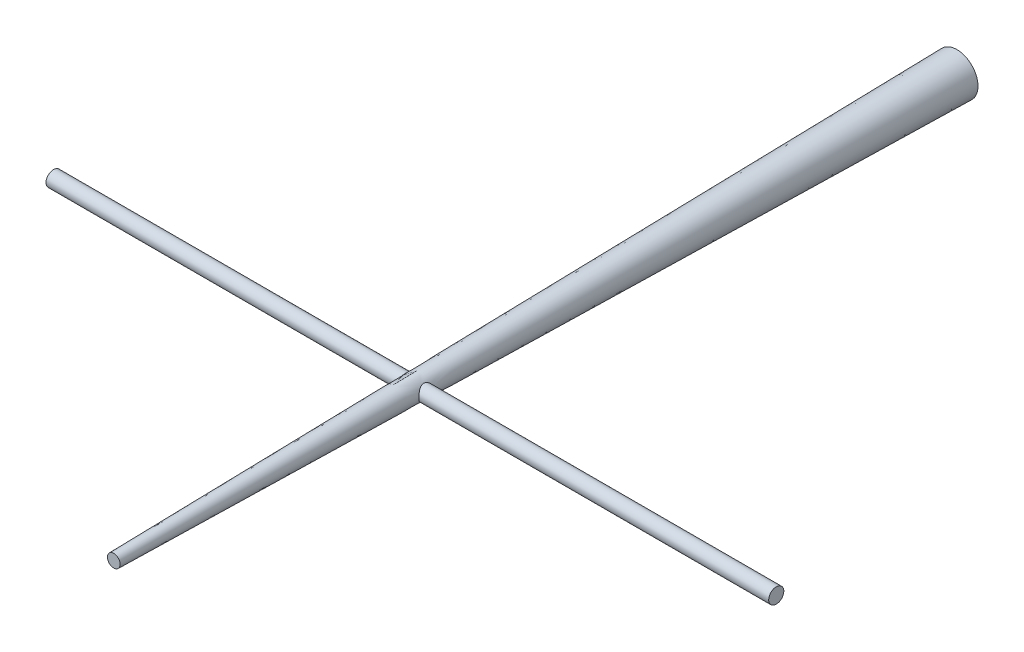
ISO-10303-21;
HEADER;
FILE_DESCRIPTION(('STEP AP214'),'2;1');
FILE_NAME('part.step','',(''),(''),'','','');
FILE_SCHEMA(('AUTOMOTIVE_DESIGN { 1 0 10303 214 1 1 1 1 }'));
ENDSEC;
DATA;
#1=APPLICATION_CONTEXT('core data for automotive mechanical design processes');
#2=APPLICATION_PROTOCOL_DEFINITION('international standard','automotive_design',2000,#1);
#3=PRODUCT_CONTEXT('',#1,'mechanical');
#4=PRODUCT('Part','Part','',(#3));
#5=PRODUCT_RELATED_PRODUCT_CATEGORY('part','',(#4));
#6=PRODUCT_DEFINITION_FORMATION('','',#4);
#7=PRODUCT_DEFINITION_CONTEXT('part definition',#1,'design');
#8=PRODUCT_DEFINITION('design','',#6,#7);
#9=PRODUCT_DEFINITION_SHAPE('','',#8);
#10=(LENGTH_UNIT() NAMED_UNIT(*) SI_UNIT(.MILLI.,.METRE.));
#11=(NAMED_UNIT(*) PLANE_ANGLE_UNIT() SI_UNIT($,.RADIAN.));
#12=(NAMED_UNIT(*) SI_UNIT($,.STERADIAN.) SOLID_ANGLE_UNIT());
#13=UNCERTAINTY_MEASURE_WITH_UNIT(LENGTH_MEASURE(1.E-05),#10,'distance_accuracy_value','');
#14=(GEOMETRIC_REPRESENTATION_CONTEXT(3) GLOBAL_UNCERTAINTY_ASSIGNED_CONTEXT((#13)) GLOBAL_UNIT_ASSIGNED_CONTEXT((#10,
#11,#12)) REPRESENTATION_CONTEXT('',''));
#15=CARTESIAN_POINT('',(0.,0.,0.));
#16=DIRECTION('',(0.,0.,1.));
#17=DIRECTION('',(1.,0.,0.));
#18=AXIS2_PLACEMENT_3D('',#15,#16,#17);
#19=CARTESIAN_POINT('',(0.,0.,0.));
#20=DIRECTION('',(0.,0.,-1.));
#21=DIRECTION('',(1.,0.,0.));
#22=AXIS2_PLACEMENT_3D('',#19,#20,#21);
#23=CONICAL_SURFACE('',#22,175.,0.0174532925199433);
#24=CARTESIAN_POINT('',(-88.2150417104571,-41.0089389072612,4452.50860679988));
#25=CARTESIAN_POINT('',(-88.8067551006763,-39.7800268956381,4451.44744015487));
#26=CARTESIAN_POINT('',(-89.3866715677512,-38.5065582815017,4450.43104609491));
#27=CARTESIAN_POINT('',(-90.5116746114934,-35.8741062610072,4448.49383958043));
#28=CARTESIAN_POINT('',(-91.0567584669479,-34.5151161899146,4447.57303459007));
#29=CARTESIAN_POINT('',(-92.1014047116843,-31.7155180485526,4445.8335083747));
#30=CARTESIAN_POINT('',(-92.6009440945044,-30.2748693183429,4445.01483866652));
#31=CARTESIAN_POINT('',(-93.5436104078845,-27.318236510657,4443.48764497268));
#32=CARTESIAN_POINT('',(-93.9867390836993,-25.8022547658794,4442.77911757924));
#33=CARTESIAN_POINT('',(-94.6028341853943,-23.4728650210854,4441.8028661265));
#34=CARTESIAN_POINT('',(-94.8007182534843,-22.6842486912337,4441.49091491734));
#35=CARTESIAN_POINT('',(-95.1784014771755,-21.0912308404779,4440.89799128026));
#36=CARTESIAN_POINT('',(-95.3582027048802,-20.2868311408356,4440.61701530255));
#37=CARTESIAN_POINT('',(-95.6986028227212,-18.6634446459311,4440.0869746647));
#38=CARTESIAN_POINT('',(-95.8591987267517,-17.8444556049569,4439.83791496658));
#39=CARTESIAN_POINT('',(-96.160081205876,-16.1935978613828,4439.37271087411));
#40=CARTESIAN_POINT('',(-96.3003702908553,-15.36173076458,4439.15656241182));
#41=CARTESIAN_POINT('',(-96.5596022520418,-13.6873116584538,4438.75815949005));
#42=CARTESIAN_POINT('',(-96.678561410206,-12.8447683292775,4438.57587917383));
#43=CARTESIAN_POINT('',(-96.8944153756877,-11.1502554879983,4438.24579145945));
#44=CARTESIAN_POINT('',(-96.991312899643,-10.29828715004,4438.09797981682));
#45=CARTESIAN_POINT('',(-97.1623592499996,-8.58676171566456,4437.837452627));
#46=CARTESIAN_POINT('',(-97.2365089049002,-7.7272048968005,4437.72473580162));
#47=CARTESIAN_POINT('',(-97.3615154169589,-6.00249424641401,4437.5349044306));
#48=CARTESIAN_POINT('',(-97.4123729243703,-5.13734057182445,4437.45778889107));
#49=CARTESIAN_POINT('',(-97.4862819704082,-3.49541762183553,4437.34578166787));
#50=CARTESIAN_POINT('',(-97.5117091536608,-2.71899849624941,4437.30728126237));
#51=CARTESIAN_POINT('',(-97.543495515013,-1.16480269875645,4437.25915830888));
#52=CARTESIAN_POINT('',(-97.5498530895679,-0.387025918187787,4437.2495381894));
#53=CARTESIAN_POINT('',(-97.5434566543303,1.16813433460402,4437.25921963327));
#54=CARTESIAN_POINT('',(-97.5307059032239,1.9455178512784,4437.27851626524));
#55=CARTESIAN_POINT('',(-97.4861741815847,3.49856552502829,4437.34595203199));
#56=CARTESIAN_POINT('',(-97.4543912585527,4.27422949750108,4437.394094126));
#57=CARTESIAN_POINT('',(-97.3719909613902,5.82212631131907,4437.51903368842));
#58=CARTESIAN_POINT('',(-97.3213763244169,6.59435963480462,4437.59582699243));
#59=CARTESIAN_POINT('',(-97.2016088467075,8.13410615537032,4437.77779422268));
#60=CARTESIAN_POINT('',(-97.1324540471383,8.90161884492897,4437.88297114776));
#61=CARTESIAN_POINT('',(-96.9760197286419,10.430349498098,4438.12131524261));
#62=CARTESIAN_POINT('',(-96.8887421241509,11.1915681177695,4438.25447945591));
#63=CARTESIAN_POINT('',(-96.6965660286601,12.7064522726591,4438.54833463863));
#64=CARTESIAN_POINT('',(-96.5916658779307,13.4601170893524,4438.70902820085));
#65=CARTESIAN_POINT('',(-96.2616216831136,15.6402116122225,4439.21590811345));
#66=CARTESIAN_POINT('',(-96.0138848798007,17.0551296442072,4439.59788103185));
#67=CARTESIAN_POINT('',(-95.4611398543868,19.8442998354549,4440.45590561592));
#68=CARTESIAN_POINT('',(-95.1561341348468,21.2185537686382,4440.93195317072));
#69=CARTESIAN_POINT('',(-94.4944694411458,23.920039862333,4441.9733443069));
#70=CARTESIAN_POINT('',(-94.1378071167552,25.2472689660582,4442.53869368024));
#71=CARTESIAN_POINT('',(-93.3790532346756,27.8490938365394,4443.75361858164));
#72=CARTESIAN_POINT('',(-92.9769588327593,29.1236863012056,4444.40319938329));
#73=CARTESIAN_POINT('',(-92.0914970552191,31.7411700527384,4445.8509499274));
#74=CARTESIAN_POINT('',(-91.6040229767769,33.0780416528376,4446.65749288845));
#75=CARTESIAN_POINT('',(-90.5910602719331,35.6780961521958,4448.3603395413));
#76=CARTESIAN_POINT('',(-90.0655695626268,36.9412750070208,4449.25664815233));
#77=CARTESIAN_POINT('',(-88.9854120880967,39.391432145557,4451.1342166535));
#78=CARTESIAN_POINT('',(-88.4307208804156,40.5783446838695,4452.11554817094));
#79=CARTESIAN_POINT('',(-87.30210858388,42.8719329880945,4454.15765123253));
#80=CARTESIAN_POINT('',(-86.7281864957257,43.9786045749393,4455.2184269084));
#81=CARTESIAN_POINT('',(-85.4773353908995,46.28147264725,4457.59303192547));
#82=CARTESIAN_POINT('',(-84.7987547969908,47.4632145998366,4458.92004584035));
#83=CARTESIAN_POINT('',(-83.4450309003382,49.7110137911037,4461.67068939557));
#84=CARTESIAN_POINT('',(-82.7698881999231,50.777051380559,4463.09433537972));
#85=CARTESIAN_POINT('',(-81.4406417500109,52.7884855521617,4466.03365637022));
#86=CARTESIAN_POINT('',(-80.7865365585378,53.7338904160873,4467.5493250484));
#87=CARTESIAN_POINT('',(-79.5185263353984,55.49808392586,4470.66849487191));
#88=CARTESIAN_POINT('',(-78.9046120594359,56.316901747351,4472.27197566267));
#89=CARTESIAN_POINT('',(-77.8484802311197,57.6780779146254,4475.25018027478));
#90=CARTESIAN_POINT('',(-77.3957680618075,58.243423544509,4476.6106964112));
#91=CARTESIAN_POINT('',(-76.5424994649826,59.2813346929939,4479.38256325502));
#92=CARTESIAN_POINT('',(-76.141937706547,59.7539096973123,4480.79390874769));
#93=CARTESIAN_POINT('',(-75.4057144699684,60.6004924008325,4483.66062885371));
#94=CARTESIAN_POINT('',(-75.0699664766281,60.9746317403301,4485.11594173299));
#95=CARTESIAN_POINT('',(-74.6234743652947,61.4583893635324,4487.32711773009));
#96=CARTESIAN_POINT('',(-74.4841488481218,61.6067496318438,4488.06898987085));
#97=CARTESIAN_POINT('',(-74.225861495448,61.8770367632609,4489.56101926765));
#98=CARTESIAN_POINT('',(-74.1068973194686,61.9989666648922,4490.31117556089));
#99=CARTESIAN_POINT('',(-73.8895795190012,62.2167850559781,4491.82520036291));
#100=CARTESIAN_POINT('',(-73.791419345275,62.3124313818698,4492.58913149942));
#101=CARTESIAN_POINT('',(-73.6181262529895,62.4757143960929,4494.12250265417));
#102=CARTESIAN_POINT('',(-73.542990689765,62.5433543016263,4494.89194202933));
#103=CARTESIAN_POINT('',(-73.4165568445914,62.6502414864425,4496.43479058127));
#104=CARTESIAN_POINT('',(-73.3652598345658,62.6894872507971,4497.20819996767));
#105=CARTESIAN_POINT('',(-73.2870677371926,62.739312466473,4498.75717550974));
#106=CARTESIAN_POINT('',(-73.2601725802002,62.7498919996102,4499.53274165925));
#107=CARTESIAN_POINT('',(-73.2310514899403,62.7422656134858,4501.08400075595));
#108=CARTESIAN_POINT('',(-73.2288192979925,62.7240669985476,4501.85969362102));
#109=CARTESIAN_POINT('',(-73.248961270952,62.6589345715854,4503.4095483375));
#110=CARTESIAN_POINT('',(-73.2713354924159,62.6120006935148,4504.18371018538));
#111=CARTESIAN_POINT('',(-73.340340441106,62.4895858291731,4505.72865800128));
#112=CARTESIAN_POINT('',(-73.3869700305379,62.4141061819999,4506.49944412594));
#113=CARTESIAN_POINT('',(-73.5038249513652,62.2349489091644,4508.03585973813));
#114=CARTESIAN_POINT('',(-73.574049696556,62.1312719840554,4508.80148935329));
#115=CARTESIAN_POINT('',(-73.79833644499,61.8081031567176,4510.89687882381));
#116=CARTESIAN_POINT('',(-73.9758049881539,61.5600128158889,4512.219887699));
#117=CARTESIAN_POINT('',(-74.3938497353455,60.9821042652881,4514.83730237272));
#118=CARTESIAN_POINT('',(-74.6344182461531,60.6522960189274,4516.1317116373));
#119=CARTESIAN_POINT('',(-75.1711171067735,59.9142940370088,4518.6872394763));
#120=CARTESIAN_POINT('',(-75.4672896500178,59.5060407702716,4519.94833193483));
#121=CARTESIAN_POINT('',(-76.1066696478958,58.6150625767474,4522.4316980072));
#122=CARTESIAN_POINT('',(-76.4498848736568,58.1323253440624,4523.65396516619));
#123=CARTESIAN_POINT('',(-77.312693604313,56.898825560567,4526.51319085932));
#124=CARTESIAN_POINT('',(-77.8497310211817,56.1159435366188,4528.13111772919));
#125=CARTESIAN_POINT('',(-78.9755346130869,54.4233197711927,4531.28044059181));
#126=CARTESIAN_POINT('',(-79.5643172393314,53.5135376303524,4532.8118088091));
#127=CARTESIAN_POINT('',(-80.7743457957526,51.5726460544206,4535.78524650243));
#128=CARTESIAN_POINT('',(-81.3956352362472,50.5413715665871,4537.22719033856));
#129=CARTESIAN_POINT('',(-82.6515222365132,48.3640743101447,4540.01512170283));
#130=CARTESIAN_POINT('',(-83.286118588316,47.2180619218152,4541.36111789246));
#131=CARTESIAN_POINT('',(-84.5591528616094,44.8018601521155,4543.96763663293));
#132=CARTESIAN_POINT('',(-85.197550261232,43.5303872857974,4545.22698987152));
#133=CARTESIAN_POINT('',(-86.4545049944383,40.8789555777765,4547.63702269992));
#134=CARTESIAN_POINT('',(-87.0730611353911,39.49899023188,4548.78769576518));
#135=CARTESIAN_POINT('',(-88.2740709182082,36.6371853747765,4550.97173868822));
#136=CARTESIAN_POINT('',(-88.8565663480489,35.1554681431468,4552.00524552138));
#137=CARTESIAN_POINT('',(-89.9713165179995,32.0948126805749,4553.94786544373));
#138=CARTESIAN_POINT('',(-90.5035802140388,30.5158918635414,4554.85700072045));
#139=CARTESIAN_POINT('',(-91.427090072799,27.5173810198688,4556.41239986949));
#140=CARTESIAN_POINT('',(-91.8274505182489,26.1103985888787,4557.07759996679));
#141=CARTESIAN_POINT('',(-92.5737975188419,23.2385700772531,4558.30585328922));
#142=CARTESIAN_POINT('',(-92.9197893333466,21.7737296107032,4558.86891639543));
#143=CARTESIAN_POINT('',(-93.5497467228967,18.7945461221069,4559.88661820526));
#144=CARTESIAN_POINT('',(-93.8337401729827,17.2802257002597,4560.34130564407));
#145=CARTESIAN_POINT('',(-94.3333384146191,14.2108331857603,4561.13698543622));
#146=CARTESIAN_POINT('',(-94.5489424959963,12.655760670109,4561.4779766089));
#147=CARTESIAN_POINT('',(-94.9072684778837,9.50903331554484,4562.04280685371));
#148=CARTESIAN_POINT('',(-95.0496687242961,7.91724860392217,4562.26612899922));
#149=CARTESIAN_POINT('',(-95.2565036804821,4.7161561898393,4562.59002454105));
#150=CARTESIAN_POINT('',(-95.3209381941268,3.10684844330882,4562.69059762859));
#151=CARTESIAN_POINT('',(-95.3701428005729,-0.115774316613035,4562.76742510884));
#152=CARTESIAN_POINT('',(-95.3549217215683,-1.7290888661236,4562.7436932782));
#153=CARTESIAN_POINT('',(-95.2452332559903,-4.9463416389804,4562.57230977466));
#154=CARTESIAN_POINT('',(-95.1507695662805,-6.55028029622019,4562.42466388266));
#155=CARTESIAN_POINT('',(-94.8947959620219,-9.61940205660328,4562.02298374545));
#156=CARTESIAN_POINT('',(-94.7386820606591,-11.0861690007648,4561.77749987219));
#157=CARTESIAN_POINT('',(-94.3639241473403,-13.9908156305151,4561.18512386107));
#158=CARTESIAN_POINT('',(-94.1452837665936,-15.4286969884387,4560.83823761211));
#159=CARTESIAN_POINT('',(-93.6500157621301,-18.2671703524803,4560.0470407224));
#160=CARTESIAN_POINT('',(-93.3733848814537,-19.6677602591918,4559.60272460957));
#161=CARTESIAN_POINT('',(-92.7676119005994,-22.4243198058417,4558.62129490164));
#162=CARTESIAN_POINT('',(-92.4384670796153,-23.7802871294407,4558.08417649823));
#163=CARTESIAN_POINT('',(-91.7145479060136,-26.5142376447837,4556.89029490225));
#164=CARTESIAN_POINT('',(-91.3171698491659,-27.8893738937061,4556.22859712407));
#165=CARTESIAN_POINT('',(-90.4786202747834,-30.5774535682261,4554.81325120399));
#166=CARTESIAN_POINT('',(-90.0374475960857,-31.8903953434462,4554.05960062395));
#167=CARTESIAN_POINT('',(-89.1192464467034,-34.4502133964825,4552.46544631958));
#168=CARTESIAN_POINT('',(-88.6421997849774,-35.6970556025859,4551.62489844916));
#169=CARTESIAN_POINT('',(-87.6609197342304,-38.120386545228,4549.86227920569));
#170=CARTESIAN_POINT('',(-87.1566848345276,-39.2968713647665,4548.9402033008));
#171=CARTESIAN_POINT('',(-86.053031919339,-41.7468630955118,4546.87537320132));
#172=CARTESIAN_POINT('',(-85.4506468690282,-43.0086118819473,4545.72022937088));
#173=CARTESIAN_POINT('',(-84.2352914808656,-45.4313596498149,4543.31365984649));
#174=CARTESIAN_POINT('',(-83.6223197701935,-46.5923454454413,4542.06222159179));
#175=CARTESIAN_POINT('',(-82.4001638341477,-48.810113801218,4539.4671152395));
#176=CARTESIAN_POINT('',(-81.7909818258067,-49.86683991788,4538.12339784474));
#177=CARTESIAN_POINT('',(-80.5925711793568,-51.8708499679112,4535.34839572494));
#178=CARTESIAN_POINT('',(-80.003340260112,-52.8181464431461,4533.91712106377));
#179=CARTESIAN_POINT('',(-78.9179403824551,-54.5107460575088,4531.11517314358));
#180=CARTESIAN_POINT('',(-78.4183098827774,-55.2667463853691,4529.75230256457));
#181=CARTESIAN_POINT('',(-77.4629375251684,-56.680567811142,4526.96154792853));
#182=CARTESIAN_POINT('',(-77.0071953871922,-57.338389535532,4525.53366428643));
#183=CARTESIAN_POINT('',(-76.1548263591753,-58.5492134709047,4522.61948170349));
#184=CARTESIAN_POINT('',(-75.7581147719558,-59.1023661771857,4521.13327040015));
#185=CARTESIAN_POINT('',(-75.0380019961627,-60.0985435644226,4518.10708014524));
#186=CARTESIAN_POINT('',(-74.7145865564265,-60.541589655318,4516.56711171312));
#187=CARTESIAN_POINT('',(-74.199391754814,-61.2503150002272,4513.68942950155));
#188=CARTESIAN_POINT('',(-73.9948922465623,-61.532952158436,4512.3581588293));
#189=CARTESIAN_POINT('',(-73.655197145233,-62.0120117682537,4509.67145492287));
#190=CARTESIAN_POINT('',(-73.5199938363698,-62.2084438180206,4508.31602439618));
#191=CARTESIAN_POINT('',(-73.3243405153026,-62.5122865860789,4505.59085887317));
#192=CARTESIAN_POINT('',(-73.2638334474188,-62.6197652294779,4504.22113560169));
#193=CARTESIAN_POINT('',(-73.2201380630656,-62.7445087848373,4501.47630192879));
#194=CARTESIAN_POINT('',(-73.2369512218196,-62.7617719755278,4500.1011914251));
#195=CARTESIAN_POINT('',(-73.3476213078304,-62.7061480680006,4497.35655882584));
#196=CARTESIAN_POINT('',(-73.4414437726386,-62.6333012875202,4495.98703450587));
#197=CARTESIAN_POINT('',(-73.7028669787203,-62.3990773475488,4493.26278938345));
#198=CARTESIAN_POINT('',(-73.8704671566681,-62.2377008640192,4491.90806846804));
#199=CARTESIAN_POINT('',(-74.2740001589055,-61.8289183895155,4489.22036604913));
#200=CARTESIAN_POINT('',(-74.5100165033684,-61.5814071736357,4487.88741323301));
#201=CARTESIAN_POINT('',(-75.0428358511687,-61.0039348982654,4485.25191099634));
#202=CARTESIAN_POINT('',(-75.3396463388451,-60.6739636860609,4483.94936534122));
#203=CARTESIAN_POINT('',(-76.0772650798454,-59.8306498291203,4481.01574482428));
#204=CARTESIAN_POINT('',(-76.535041423653,-59.2918419042636,4479.3962196027));
#205=CARTESIAN_POINT('',(-77.5184364310482,-58.0925968852762,4476.2241057163));
#206=CARTESIAN_POINT('',(-78.0440760171387,-57.4321222539084,4474.67153789245));
#207=CARTESIAN_POINT('',(-79.1454824481759,-55.9962816738892,4471.63806094476));
#208=CARTESIAN_POINT('',(-79.7212779124442,-55.2208499503831,4470.1571934934));
#209=CARTESIAN_POINT('',(-80.9059801548306,-53.5613260217474,4467.27204508896));
#210=CARTESIAN_POINT('',(-81.5148813164788,-52.6772522161629,4465.86775122543));
#211=CARTESIAN_POINT('',(-82.6356543416859,-50.9792288629158,4463.39265164274));
#212=CARTESIAN_POINT('',(-83.1445168820542,-50.182804089631,4462.30838728366));
#213=CARTESIAN_POINT('',(-84.1664744269641,-48.5231509423562,4460.19453899855));
#214=CARTESIAN_POINT('',(-84.6795689238899,-47.6599304792057,4459.16494862158));
#215=CARTESIAN_POINT('',(-85.7026060478042,-45.8688665560149,4457.16291671501));
#216=CARTESIAN_POINT('',(-86.2125500243623,-44.9410532074634,4456.19044894105));
#217=CARTESIAN_POINT('',(-87.2227301809878,-43.0220826871142,4454.30453043339));
#218=CARTESIAN_POINT('',(-87.7229652041641,-42.0309180262348,4453.39108670298));
#219=CARTESIAN_POINT('',(-88.2150417104571,-41.0089389072612,4452.50860679988));
#220=B_SPLINE_CURVE_WITH_KNOTS('',3,(#24,#25,#26,#27,#28,#29,#30,#31,#32,#33,#34,#35,#36,#37,
#38,#39,#40,#41,#42,#43,#44,#45,#46,#47,#48,#49,#50,#51,#52,#53,#54,#55,#56,#57,#58,#59,#60,#61,
#62,#63,#64,#65,#66,#67,#68,#69,#70,#71,#72,#73,#74,#75,#76,#77,#78,#79,#80,#81,#82,#83,#84,#85,
#86,#87,#88,#89,#90,#91,#92,#93,#94,#95,#96,#97,#98,#99,#100,#101,#102,#103,#104,#105,#106,#107,
#108,#109,#110,#111,#112,#113,#114,#115,#116,#117,#118,#119,#120,#121,#122,#123,#124,#125,#126,
#127,#128,#129,#130,#131,#132,#133,#134,#135,#136,#137,#138,#139,#140,#141,#142,#143,#144,#145,
#146,#147,#148,#149,#150,#151,#152,#153,#154,#155,#156,#157,#158,#159,#160,#161,#162,#163,#164,
#165,#166,#167,#168,#169,#170,#171,#172,#173,#174,#175,#176,#177,#178,#179,#180,#181,#182,#183,
#184,#185,#186,#187,#188,#189,#190,#191,#192,#193,#194,#195,#196,#197,#198,#199,#200,#201,#202,
#203,#204,#205,#206,#207,#208,#209,#210,#211,#212,#213,#214,#215,#216,#217,#218,#219),
.UNSPECIFIED.,.T.,.F.,(4,2,2,2,2,2,2,2,2,2,2,2,2,2,2,2,2,2,2,2,2,2,2,2,2,2,2,2,2,2,2,2,2,2,2,2,
2,2,2,2,2,2,2,2,2,2,2,2,2,2,2,2,2,2,2,2,2,2,2,2,2,2,2,2,2,2,2,2,2,2,2,2,2,2,2,2,2,2,2,2,2,2,2,2,
2,2,2,2,2,2,2,2,2,2,2,2,2,4),(0.,5.18337580029485,10.3671560453758,15.5535404972823,
20.7397644519373,23.3516002953337,25.9631365079634,28.5750782441975,31.1866968730693,
33.7963133859206,36.4056083803345,39.014808330415,41.6239354342962,43.9565491797801,
46.2893590669872,48.6217711678919,50.9544225905522,53.2867350986881,55.6192941209693,
57.9516068642671,60.2841393931128,64.7380005092703,69.1916670440233,73.6456225542597,
78.0998570543493,83.0019794725111,87.9043706782587,92.8109328126245,97.7177503047305,
103.417903068439,109.119022337736,114.819749998223,120.51916179607,125.138900097904,
129.758165789137,134.37122226307,136.678436445474,138.985385241778,141.312926135992,
143.640199582661,145.967597188473,148.29498815169,150.621788483153,152.948594162667,
155.275290703971,157.601929444445,161.670284115194,165.738142997869,169.809101220144,
173.880732749016,179.50052604232,185.122112529093,190.751426226275,196.380231101721,
202.074170931315,207.768452376925,213.456006630249,219.142544913313,223.958617158216,
228.774223232127,233.58765968521,238.40114612065,243.235605787407,248.070077615601,
252.904013652767,257.737724187409,262.218678989188,266.699373613486,271.180319957512,
275.661498539828,280.387585871295,285.1137985429,289.842424164149,294.571312797118,
300.006579589908,305.442556570548,310.881460483567,316.319740417354,321.225176358406,
326.130580996551,331.028878037682,335.926221871406,340.05055116853,344.174421142366,
348.295139202839,352.415935884455,356.534889472381,360.653811610807,364.777783321262,
368.902263037455,374.196024155418,379.49142127555,384.789860034487,390.087402687124,
394.399961410974,398.712010163346,403.022062042112,407.332624379848),.UNSPECIFIED.);
#221=CARTESIAN_POINT('',(-88.2150417104571,-41.0089389072612,4452.50860679988));
#222=VERTEX_POINT('',#221);
#223=EDGE_CURVE('E41',#222,#222,#220,.T.);
#224=ORIENTED_EDGE('',*,*,#223,.T.);
#225=EDGE_LOOP('',(#224));
#226=FACE_BOUND('',#225,.T.);
#227=CARTESIAN_POINT('',(84.1538092680169,-48.5340778521606,4460.23055462508));
#228=CARTESIAN_POINT('',(83.5173991063664,-49.5924252896431,4461.52214546167));
#229=CARTESIAN_POINT('',(82.8824060200282,-50.5996592058198,4462.85647660744));
#230=CARTESIAN_POINT('',(81.6296979296321,-52.5080030949633,4465.60701545071));
#231=CARTESIAN_POINT('',(81.0119854575902,-53.4090975774667,4467.02323505452));
#232=CARTESIAN_POINT('',(79.8096952800758,-55.1001741765797,4469.93392286975));
#233=CARTESIAN_POINT('',(79.2251149187288,-55.8901652067988,4471.42838479073));
#234=CARTESIAN_POINT('',(78.1063215605884,-57.3530053313643,4474.49161594426));
#235=CARTESIAN_POINT('',(77.5720979483683,-58.0258791399728,4476.0603694106));
#236=CARTESIAN_POINT('',(76.6573873958882,-59.143601073061,4478.99455631421));
#237=CARTESIAN_POINT('',(76.2661970616208,-59.607767660719,4480.34930294281));
#238=CARTESIAN_POINT('',(75.5422764665185,-60.4457198525001,4483.10179653208));
#239=CARTESIAN_POINT('',(75.20954061128,-60.8195141070243,4484.49953936271));
#240=CARTESIAN_POINT('',(74.6136639752154,-61.4714227614195,4487.32975318257));
#241=CARTESIAN_POINT('',(74.3504271480296,-61.7496693680449,4488.76217322602));
#242=CARTESIAN_POINT('',(73.9024983251164,-62.2066822630278,4491.65505669688));
#243=CARTESIAN_POINT('',(73.7178051068929,-62.3854500997413,4493.11551968745));
#244=CARTESIAN_POINT('',(73.4333539302794,-62.6407877957003,4496.06311654357));
#245=CARTESIAN_POINT('',(73.3341423483248,-62.7167019798704,4497.55036084148));
#246=CARTESIAN_POINT('',(73.2266549396007,-62.7622851409355,4500.52979940201));
#247=CARTESIAN_POINT('',(73.2183788790849,-62.7319543909293,4502.02199365188));
#248=CARTESIAN_POINT('',(73.2926334300836,-62.5651831355092,4504.9986417655));
#249=CARTESIAN_POINT('',(73.3751962131576,-62.4287050418837,4506.48309269975));
#250=CARTESIAN_POINT('',(73.6269170624493,-62.0518058270481,4509.43119042452));
#251=CARTESIAN_POINT('',(73.7960740337422,-61.8113860201164,4510.89483747786));
#252=CARTESIAN_POINT('',(74.1943824381516,-61.2567532894323,4513.65944398516));
#253=CARTESIAN_POINT('',(74.4167254461246,-60.9511793111391,4514.96314637163));
#254=CARTESIAN_POINT('',(74.9191867900794,-60.2608202814003,4517.53782512677));
#255=CARTESIAN_POINT('',(75.199300739049,-59.8760412446361,4518.80880397216));
#256=CARTESIAN_POINT('',(75.8090879878314,-59.0309613665978,4521.31334357533));
#257=CARTESIAN_POINT('',(76.1387716925335,-58.5706446678087,4522.54689641176));
#258=CARTESIAN_POINT('',(76.839193821171,-57.5780968837642,4524.97290819186));
#259=CARTESIAN_POINT('',(77.2099381413535,-57.0458554677976,4526.16536120133));
#260=CARTESIAN_POINT('',(77.8217760363012,-56.1503747522475,4528.01555924863));
#261=CARTESIAN_POINT('',(78.052096708105,-55.8097771348899,4528.6879773281));
#262=CARTESIAN_POINT('',(78.5221165950475,-55.1061302596081,4530.01741833908));
#263=CARTESIAN_POINT('',(78.7618139404414,-54.7430854694384,4530.67444429847));
#264=CARTESIAN_POINT('',(79.4927908679791,-53.6208983001303,4532.62224234105));
#265=CARTESIAN_POINT('',(79.9959522768629,-52.8287075613677,4533.88972543692));
#266=CARTESIAN_POINT('',(81.022586925998,-51.1595584155592,4536.360559511));
#267=CARTESIAN_POINT('',(81.546078375301,-50.282522916042,4537.56385059297));
#268=CARTESIAN_POINT('',(82.6022328980695,-48.4473571002904,4539.9027408224));
#269=CARTESIAN_POINT('',(83.1348966063542,-47.489221152914,4541.03833526007));
#270=CARTESIAN_POINT('',(84.314334341448,-45.2790506665383,4543.476827058));
#271=CARTESIAN_POINT('',(84.9609034471912,-44.0082376418355,4544.76287734859));
#272=CARTESIAN_POINT('',(86.2357777978518,-41.3551804517236,4547.22488729967));
#273=CARTESIAN_POINT('',(86.8640799220361,-39.9729173966164,4548.40082822436));
#274=CARTESIAN_POINT('',(88.0859784700934,-37.1026477952818,4550.63461616194));
#275=CARTESIAN_POINT('',(88.6795902148835,-35.6146885827039,4551.69251549821));
#276=CARTESIAN_POINT('',(89.8168738159042,-32.5386958430813,4553.68195097968));
#277=CARTESIAN_POINT('',(90.3605564174321,-30.950683973084,4554.61351433443));
#278=CARTESIAN_POINT('',(91.3014344381461,-27.9439775561476,4556.20240550224));
#279=CARTESIAN_POINT('',(91.7081514315918,-26.5388219021406,4556.87976462698));
#280=CARTESIAN_POINT('',(92.4676665939485,-23.6695830830556,4558.13231327153));
#281=CARTESIAN_POINT('',(92.8204698806647,-22.2055055278794,4558.70751248981));
#282=CARTESIAN_POINT('',(93.4642896384114,-19.2269879056613,4559.74927491777));
#283=CARTESIAN_POINT('',(93.7553456793532,-17.7125808158388,4560.21590771948));
#284=CARTESIAN_POINT('',(94.2692321794452,-14.6418136108735,4561.03529909856));
#285=CARTESIAN_POINT('',(94.4920619746718,-13.0854530876334,4561.38805656779));
#286=CARTESIAN_POINT('',(94.8648901920428,-9.93455847275999,4561.97620532502));
#287=CARTESIAN_POINT('',(95.0145509227612,-8.33988236894168,4562.21105256292));
#288=CARTESIAN_POINT('',(95.2356548915224,-5.13175536525372,4562.55744093729));
#289=CARTESIAN_POINT('',(95.3070979072243,-3.51830441202806,4562.66898172324));
#290=CARTESIAN_POINT('',(95.3698733086916,-0.286196857326505,4562.76700898012));
#291=CARTESIAN_POINT('',(95.3612132583672,1.33245923821346,4562.75350725845));
#292=CARTESIAN_POINT('',(95.2640255161764,4.56142533702449,4562.60168456938));
#293=CARTESIAN_POINT('',(95.1755017906194,6.17173575077698,4562.46336980062));
#294=CARTESIAN_POINT('',(94.9305694973638,9.24988323630367,4562.0791946667));
#295=CARTESIAN_POINT('',(94.7797923241336,10.7192960371329,4561.84224476459));
#296=CARTESIAN_POINT('',(94.4153202553522,13.6299710971196,4561.26654933068));
#297=CARTESIAN_POINT('',(94.2016291331675,15.0712350390243,4560.92780990384));
#298=CARTESIAN_POINT('',(93.7157923328487,17.917095357258,4560.15246120388));
#299=CARTESIAN_POINT('',(93.4436437027466,19.3216898778478,4559.71584698826));
#300=CARTESIAN_POINT('',(92.8463080420323,22.086776013643,4558.74934176397));
#301=CARTESIAN_POINT('',(92.5211182946689,23.4472653655129,4558.21944597732));
#302=CARTESIAN_POINT('',(91.8057449367884,26.1870938886881,4557.04155369871));
#303=CARTESIAN_POINT('',(91.4130677181147,27.5637609567466,4556.38886246111));
#304=CARTESIAN_POINT('',(90.5834834364835,30.255594779382,4554.99149530377));
#305=CARTESIAN_POINT('',(90.1465752863626,31.5707600211278,4554.24681712296));
#306=CARTESIAN_POINT('',(89.2363960613563,34.1356340487601,4552.67058918956));
#307=CARTESIAN_POINT('',(88.7631073495389,35.3853105863642,4551.83899723088));
#308=CARTESIAN_POINT('',(87.7887434713989,37.8149098260559,4550.09426390192));
#309=CARTESIAN_POINT('',(87.2876667526714,38.9948286234341,4549.1811179738));
#310=CARTESIAN_POINT('',(86.1904835937495,41.4518871248826,4547.13625735437));
#311=CARTESIAN_POINT('',(85.5913182982067,42.7174292602923,4545.99222524626));
#312=CARTESIAN_POINT('',(84.3813607486317,45.1486686508417,4543.60805841164));
#313=CARTESIAN_POINT('',(83.7705670173042,46.3143531150434,4542.36791141225));
#314=CARTESIAN_POINT('',(82.5514928362728,48.542528247674,4539.79554793999));
#315=CARTESIAN_POINT('',(81.9432140432107,49.6049588836206,4538.46327866786));
#316=CARTESIAN_POINT('',(80.7451099914719,51.6214379571668,4535.71137048034));
#317=CARTESIAN_POINT('',(80.1552827753345,52.5754979198642,4534.29174088043));
#318=CARTESIAN_POINT('',(79.0624544012852,54.2893181436073,4531.50033231429));
#319=CARTESIAN_POINT('',(78.5564154289715,55.058836239059,4530.13573429137));
#320=CARTESIAN_POINT('',(77.5874363996489,56.4990186465998,4527.34040864525));
#321=CARTESIAN_POINT('',(77.124496334558,57.1696829772263,4525.90968103444));
#322=CARTESIAN_POINT('',(76.2571453736992,58.4054756257682,4522.98862888674));
#323=CARTESIAN_POINT('',(75.8526512607597,58.9707543348743,4521.49839301934));
#324=CARTESIAN_POINT('',(75.1166541776209,59.9904025836692,4518.46290248998));
#325=CARTESIAN_POINT('',(74.7851365792409,60.4447943526902,4516.91765892662));
#326=CARTESIAN_POINT('',(74.2561358743361,61.1720882325993,4514.0349502647));
#327=CARTESIAN_POINT('',(74.0456498594881,61.4624533085015,4512.70426554331));
#328=CARTESIAN_POINT('',(73.6936136852779,61.9570027965816,4510.01796692728));
#329=CARTESIAN_POINT('',(73.552055737492,62.1611969451666,4508.66235586713));
#330=CARTESIAN_POINT('',(73.3435478604785,62.4804904177612,4505.93599219587));
#331=CARTESIAN_POINT('',(73.2765403051726,62.5956585362026,4504.56525210815));
#332=CARTESIAN_POINT('',(73.2199446678432,62.7355918070139,4501.81751225814));
#333=CARTESIAN_POINT('',(73.2303580143844,62.7603552912315,4500.44051238082));
#334=CARTESIAN_POINT('',(73.3285992607471,62.719405482393,4497.69089730245));
#335=CARTESIAN_POINT('',(73.4164138333381,62.6537077641878,4496.31828138737));
#336=CARTESIAN_POINT('',(73.6664298866539,62.4333088572683,4493.58715243588));
#337=CARTESIAN_POINT('',(73.828630682443,62.278608488072,4492.22863926972));
#338=CARTESIAN_POINT('',(74.2220856724285,61.8826712417768,4489.53297779684));
#339=CARTESIAN_POINT('',(74.4534153905617,61.6413396610094,4488.19585455073));
#340=CARTESIAN_POINT('',(74.977671672669,61.0756789964111,4485.55161556));
#341=CARTESIAN_POINT('',(75.2706061541837,60.7513392430764,4484.24450369647));
#342=CARTESIAN_POINT('',(75.9978997837539,59.9230142389873,4481.3099032857));
#343=CARTESIAN_POINT('',(76.4489783824347,59.3941537612007,4479.69354510129));
#344=CARTESIAN_POINT('',(77.4195263148778,58.2153981761613,4476.52683306751));
#345=CARTESIAN_POINT('',(77.9390144650877,57.5654697479955,4474.9764975339));
#346=CARTESIAN_POINT('',(79.0291088703006,56.1509413649629,4471.9458250459));
#347=CARTESIAN_POINT('',(79.5997683055473,55.3862215426803,4470.46556341489));
#348=CARTESIAN_POINT('',(80.7751182253038,53.7485348029052,4467.58068810337));
#349=CARTESIAN_POINT('',(81.3798068566463,52.8755737769202,4466.17607031156));
#350=CARTESIAN_POINT('',(82.6180577046802,51.0110189283341,4463.42337166087));
#351=CARTESIAN_POINT('',(83.2519295974584,50.0177263114271,4462.07658216419));
#352=CARTESIAN_POINT('',(84.5245285798937,47.9281438013954,4459.46789845442));
#353=CARTESIAN_POINT('',(85.1632556625591,46.8318540565673,4458.20600411909));
#354=CARTESIAN_POINT('',(86.4320430480585,44.5395148332403,4455.77112135947));
#355=CARTESIAN_POINT('',(87.0621016275142,43.3434458422537,4454.59815041073));
#356=CARTESIAN_POINT('',(88.3006091167319,40.8547541694962,4452.34635481217));
#357=CARTESIAN_POINT('',(88.9090563368869,39.5621239628399,4451.26753751385));
#358=CARTESIAN_POINT('',(89.8321717489874,37.4720251483882,4449.66203366343));
#359=CARTESIAN_POINT('',(90.1586320283326,36.7060749633896,4449.10073502265));
#360=CARTESIAN_POINT('',(90.7986051582596,35.145845621616,4448.01115341028));
#361=CARTESIAN_POINT('',(91.1121192944074,34.3515692923265,4447.48286715782));
#362=CARTESIAN_POINT('',(91.7241520170267,32.7353702860779,4446.46052280944));
#363=CARTESIAN_POINT('',(92.0226668279171,31.9134407344075,4445.96647331972));
#364=CARTESIAN_POINT('',(92.6024831594549,30.2432905509165,4445.0142497174));
#365=CARTESIAN_POINT('',(92.8837870539709,29.3950735692945,4444.55607065481));
#366=CARTESIAN_POINT('',(93.4269769746122,27.6741000016161,4443.67733584799));
#367=CARTESIAN_POINT('',(93.6888764961038,26.8013610639517,4443.25675391284));
#368=CARTESIAN_POINT('',(94.1914474203997,25.0323561961395,4442.45445508567));
#369=CARTESIAN_POINT('',(94.4321217333922,24.136093513267,4442.07273286449));
#370=CARTESIAN_POINT('',(94.8903423738505,22.3217302069594,4441.34968520492));
#371=CARTESIAN_POINT('',(95.1078912286522,21.4036319833359,4441.00835535167));
#372=CARTESIAN_POINT('',(95.5180767704737,19.5474783698992,4440.36758067141));
#373=CARTESIAN_POINT('',(95.7107145289945,18.6094238404891,4440.06813404284));
#374=CARTESIAN_POINT('',(96.0465640538677,16.8362208862367,4439.54796320249));
#375=CARTESIAN_POINT('',(96.1929460274034,16.003184809214,4439.32207005031));
#376=CARTESIAN_POINT('',(96.4644737413275,14.3252419925461,4438.90417037363));
#377=CARTESIAN_POINT('',(96.5896201225381,13.480335611942,4438.71216282656));
#378=CARTESIAN_POINT('',(96.8177878327631,11.7804643803952,4438.36284387548));
#379=CARTESIAN_POINT('',(96.9208103497784,10.9255000721419,4438.20553060845));
#380=CARTESIAN_POINT('',(97.1039913906368,9.20737138808363,4437.92627540972));
#381=CARTESIAN_POINT('',(97.1841498084571,8.3442069742733,4437.80433364203));
#382=CARTESIAN_POINT('',(97.3209446800508,6.61248235875251,4437.59647118253));
#383=CARTESIAN_POINT('',(97.3776021312567,5.74392768050422,4437.51051833501));
#384=CARTESIAN_POINT('',(97.4670702421311,4.00277014550229,4437.37487870018));
#385=CARTESIAN_POINT('',(97.4998811068757,3.13016732362685,4437.325191601));
#386=CARTESIAN_POINT('',(97.5414047633161,1.3831531167863,4437.26232125294));
#387=CARTESIAN_POINT('',(97.5501196685907,0.508741897178641,4437.2491348024));
#388=CARTESIAN_POINT('',(97.5433894822342,-1.23975488744682,4437.25932120533));
#389=CARTESIAN_POINT('',(97.527945241794,-2.11384046285265,4437.28269277076));
#390=CARTESIAN_POINT('',(97.4768883150243,-3.7365687399303,4437.36001856821));
#391=CARTESIAN_POINT('',(97.4444218614367,-4.48554369705007,4437.40920291396));
#392=CARTESIAN_POINT('',(97.3619275158794,-5.98035180816477,4437.53430175361));
#393=CARTESIAN_POINT('',(97.3118981976937,-6.72618470202498,4437.61021841834));
#394=CARTESIAN_POINT('',(97.194565710203,-8.21315953988528,4437.78850555597));
#395=CARTESIAN_POINT('',(97.1272662528103,-8.95430245688241,4437.89087034436));
#396=CARTESIAN_POINT('',(96.9757635875984,-10.4307926787753,4438.12171061569));
#397=CARTESIAN_POINT('',(96.8915587647634,-11.1661394229661,4438.25018859333));
#398=CARTESIAN_POINT('',(96.6142315393627,-13.3615999116504,4438.6742011147));
#399=CARTESIAN_POINT('',(96.3963752958914,-14.8113983091648,4439.00834610714));
#400=CARTESIAN_POINT('',(95.8992894816037,-17.6736231943813,4439.77537870019));
#401=CARTESIAN_POINT('',(95.6200571238264,-19.086047981762,4440.20827078474));
#402=CARTESIAN_POINT('',(95.0020677217033,-21.8824526748269,4441.17366885742));
#403=CARTESIAN_POINT('',(94.6626476674887,-23.2659008495603,4441.70728916742));
#404=CARTESIAN_POINT('',(93.9329873617529,-25.9802569263401,4442.86533999762));
#405=CARTESIAN_POINT('',(93.5427466892444,-27.3111643930314,4443.48977127009));
#406=CARTESIAN_POINT('',(92.7183295550064,-29.9151926081798,4444.82403415609));
#407=CARTESIAN_POINT('',(92.2841530371343,-31.1883132827923,4445.53386587876));
#408=CARTESIAN_POINT('',(91.3790487561901,-33.6726329291472,4447.03373840166));
#409=CARTESIAN_POINT('',(90.9081207364748,-34.883831468377,4447.82377976204));
#410=CARTESIAN_POINT('',(89.9384198129454,-37.2373667431846,4449.47668381466));
#411=CARTESIAN_POINT('',(89.4397387276205,-38.3799072504447,4450.33931070898));
#412=CARTESIAN_POINT('',(88.4206726421985,-40.5976387992329,4452.13526074276));
#413=CARTESIAN_POINT('',(87.9002880230895,-41.672831022178,4453.06858264146));
#414=CARTESIAN_POINT('',(86.8451537309424,-43.7543038831936,4455.00282215503));
#415=CARTESIAN_POINT('',(86.3103962140542,-44.7605457837738,4456.0037771503));
#416=CARTESIAN_POINT('',(85.2346891902641,-46.7014847264832,4458.06974864922));
#417=CARTESIAN_POINT('',(84.6937392368713,-47.6361765718368,4459.13476979606));
#418=CARTESIAN_POINT('',(84.1538092680169,-48.5340778521606,4460.23055462508));
#419=B_SPLINE_CURVE_WITH_KNOTS('',3,(#227,#228,#229,#230,#231,#232,#233,#234,#235,#236,#237,
#238,#239,#240,#241,#242,#243,#244,#245,#246,#247,#248,#249,#250,#251,#252,#253,#254,#255,#256,
#257,#258,#259,#260,#261,#262,#263,#264,#265,#266,#267,#268,#269,#270,#271,#272,#273,#274,#275,
#276,#277,#278,#279,#280,#281,#282,#283,#284,#285,#286,#287,#288,#289,#290,#291,#292,#293,#294,
#295,#296,#297,#298,#299,#300,#301,#302,#303,#304,#305,#306,#307,#308,#309,#310,#311,#312,#313,
#314,#315,#316,#317,#318,#319,#320,#321,#322,#323,#324,#325,#326,#327,#328,#329,#330,#331,#332,
#333,#334,#335,#336,#337,#338,#339,#340,#341,#342,#343,#344,#345,#346,#347,#348,#349,#350,#351,
#352,#353,#354,#355,#356,#357,#358,#359,#360,#361,#362,#363,#364,#365,#366,#367,#368,#369,#370,
#371,#372,#373,#374,#375,#376,#377,#378,#379,#380,#381,#382,#383,#384,#385,#386,#387,#388,#389,
#390,#391,#392,#393,#394,#395,#396,#397,#398,#399,#400,#401,#402,#403,#404,#405,#406,#407,#408,
#409,#410,#411,#412,#413,#414,#415,#416,#417,#418),.UNSPECIFIED.,.T.,.F.,(4,2,2,2,2,2,2,2,2,2,2,
2,2,2,2,2,2,2,2,2,2,2,2,2,2,2,2,2,2,2,2,2,2,2,2,2,2,2,2,2,2,2,2,2,2,2,2,2,2,2,2,2,2,2,2,2,2,2,2,
2,2,2,2,2,2,2,2,2,2,2,2,2,2,2,2,2,2,2,2,2,2,2,2,2,2,2,2,2,2,2,2,2,2,2,2,4),(0.,5.35990019803858,
10.7205816771795,16.0808328338381,21.4399514867994,25.889414202629,30.3384508490257,
34.7813064388033,39.2240928749826,43.6950701473044,48.1660359271512,52.6385856577615,
57.1110788374075,61.1791328289965,65.2468780141934,69.3154782304041,73.3846634513122,
75.7486730306098,78.1122135964522,82.839326522893,87.5707757247493,92.3025537207452,
98.0564280650255,103.811279693488,109.563570193852,115.314619823029,120.145899461736,
124.976720201779,129.80443575943,134.632198295082,139.482036490784,144.331888472548,
149.181282500922,154.030435704678,158.513389425487,162.996074328597,167.478985650094,
171.962126657204,176.677421082549,181.392831434464,186.110542364946,190.828517121098,
196.247390703466,201.666957363847,207.089656379882,212.51177815703,217.446209311737,
222.380639541127,227.307973239077,232.234318349172,236.364498167838,240.494211194658,
244.620729806825,248.747324561395,252.873208922329,256.999055293586,261.129425769591,
265.260327412043,270.531190798001,275.803507005852,281.081367468352,286.358940785889,
291.722364004753,297.085779501412,302.45024631903,307.815131619299,310.826700417865,
313.837969441655,316.849992693521,319.861599561872,322.871091862603,325.880170888261,
328.888920718756,331.897541090805,334.522924075638,337.148227820708,339.773390557697,
342.3985654676,345.02138978104,347.644191538435,350.266763229305,352.88924252208,
355.142440464386,357.395821422973,359.648718462039,361.901830829034,366.407256658224,
370.912887111646,375.471641352989,380.030433360491,384.589231193426,389.148060864226,
393.692613941587,398.237087276501,402.784093189829,407.331429045504),.UNSPECIFIED.);
#420=CARTESIAN_POINT('',(84.1538092680169,-48.5340778521606,4460.23055462508));
#421=VERTEX_POINT('',#420);
#422=EDGE_CURVE('E58',#421,#421,#419,.T.);
#423=ORIENTED_EDGE('',*,*,#422,.T.);
#424=EDGE_LOOP('',(#423));
#425=FACE_BOUND('',#424,.T.);
#426=CARTESIAN_POINT('',(0.,0.,7000.));
#427=DIRECTION('',(0.,0.,1.));
#428=DIRECTION('',(1.,0.,0.));
#429=AXIS2_PLACEMENT_3D('',#426,#427,#428);
#430=CIRCLE('',#429,52.8145455024766);
#431=CARTESIAN_POINT('',(52.8145455024766,0.,7000.));
#432=VERTEX_POINT('',#431);
#433=EDGE_CURVE('E10',#432,#432,#430,.T.);
#434=ORIENTED_EDGE('',*,*,#433,.F.);
#435=EDGE_LOOP('',(#434));
#436=FACE_BOUND('',#435,.T.);
#437=CARTESIAN_POINT('',(0.,0.,0.));
#438=DIRECTION('',(0.,0.,1.));
#439=DIRECTION('',(1.,0.,0.));
#440=AXIS2_PLACEMENT_3D('',#437,#438,#439);
#441=CIRCLE('',#440,175.);
#442=CARTESIAN_POINT('',(175.,0.,0.));
#443=VERTEX_POINT('',#442);
#444=EDGE_CURVE('E50',#443,#443,#441,.T.);
#445=ORIENTED_EDGE('',*,*,#444,.T.);
#446=EDGE_LOOP('',(#445));
#447=FACE_BOUND('',#446,.T.);
#448=ADVANCED_FACE('F37',(#226,#425,#436,#447),#23,.T.);
#449=CARTESIAN_POINT('',(0.,0.,7000.));
#450=DIRECTION('',(0.,0.,1.));
#451=DIRECTION('',(1.,0.,0.));
#452=AXIS2_PLACEMENT_3D('',#449,#450,#451);
#453=PLANE('',#452);
#454=ORIENTED_EDGE('',*,*,#433,.T.);
#455=EDGE_LOOP('',(#454));
#456=FACE_BOUND('',#455,.T.);
#457=ADVANCED_FACE('F74',(#456),#453,.T.);
#458=CARTESIAN_POINT('',(0.,0.,0.));
#459=DIRECTION('',(0.,0.,1.));
#460=DIRECTION('',(1.,0.,0.));
#461=AXIS2_PLACEMENT_3D('',#458,#459,#460);
#462=PLANE('',#461);
#463=ORIENTED_EDGE('',*,*,#444,.F.);
#464=EDGE_LOOP('',(#463));
#465=FACE_BOUND('',#464,.T.);
#466=ADVANCED_FACE('F77',(#465),#462,.F.);
#467=CARTESIAN_POINT('',(3000.,0.,4500.));
#468=DIRECTION('',(1.,0.,0.));
#469=DIRECTION('',(0.,0.,-1.));
#470=AXIS2_PLACEMENT_3D('',#467,#468,#469);
#471=PLANE('',#470);
#472=CARTESIAN_POINT('',(3000.,0.,4500.));
#473=DIRECTION('',(1.,0.,0.));
#474=DIRECTION('',(0.,0.,-1.));
#475=AXIS2_PLACEMENT_3D('',#472,#473,#474);
#476=CIRCLE('',#475,62.7468365608045);
#477=CARTESIAN_POINT('',(3000.,0.,4437.2531634392));
#478=VERTEX_POINT('',#477);
#479=EDGE_CURVE('E103',#478,#478,#476,.T.);
#480=ORIENTED_EDGE('',*,*,#479,.T.);
#481=EDGE_LOOP('',(#480));
#482=FACE_BOUND('',#481,.T.);
#483=ADVANCED_FACE('F79',(#482),#471,.T.);
#484=CARTESIAN_POINT('',(-3000.,0.,4500.));
#485=DIRECTION('',(1.,0.,0.));
#486=DIRECTION('',(0.,0.,-1.));
#487=AXIS2_PLACEMENT_3D('',#484,#485,#486);
#488=CYLINDRICAL_SURFACE('',#487,62.7468365608045);
#489=ORIENTED_EDGE('',*,*,#479,.F.);
#490=EDGE_LOOP('',(#489));
#491=FACE_BOUND('',#490,.T.);
#492=ORIENTED_EDGE('',*,*,#422,.F.);
#493=EDGE_LOOP('',(#492));
#494=FACE_BOUND('',#493,.T.);
#495=ADVANCED_FACE('F71',(#491,#494),#488,.T.);
#496=CARTESIAN_POINT('',(-3000.,0.,4500.));
#497=DIRECTION('',(1.,0.,0.));
#498=DIRECTION('',(0.,0.,-1.));
#499=AXIS2_PLACEMENT_3D('',#496,#497,#498);
#500=CIRCLE('',#499,62.7468365608045);
#501=CARTESIAN_POINT('',(-3000.,0.,4437.2531634392));
#502=VERTEX_POINT('',#501);
#503=EDGE_CURVE('E64',#502,#502,#500,.T.);
#504=ORIENTED_EDGE('',*,*,#503,.T.);
#505=EDGE_LOOP('',(#504));
#506=FACE_BOUND('',#505,.T.);
#507=ORIENTED_EDGE('',*,*,#223,.F.);
#508=EDGE_LOOP('',(#507));
#509=FACE_BOUND('',#508,.T.);
#510=ADVANCED_FACE('F65',(#506,#509),#488,.T.);
#511=CARTESIAN_POINT('',(-3000.,0.,4500.));
#512=DIRECTION('',(1.,0.,0.));
#513=DIRECTION('',(0.,0.,-1.));
#514=AXIS2_PLACEMENT_3D('',#511,#512,#513);
#515=PLANE('',#514);
#516=ORIENTED_EDGE('',*,*,#503,.F.);
#517=EDGE_LOOP('',(#516));
#518=FACE_BOUND('',#517,.T.);
#519=ADVANCED_FACE('F70',(#518),#515,.F.);
#520=CLOSED_SHELL('',(#448,#457,#466,#483,#495,#510,#519));
#521=MANIFOLD_SOLID_BREP('B2',#520);
#522=ADVANCED_BREP_SHAPE_REPRESENTATION('',(#18,#521),#14);
#523=SHAPE_DEFINITION_REPRESENTATION(#9,#522);
ENDSEC;
END-ISO-10303-21;
